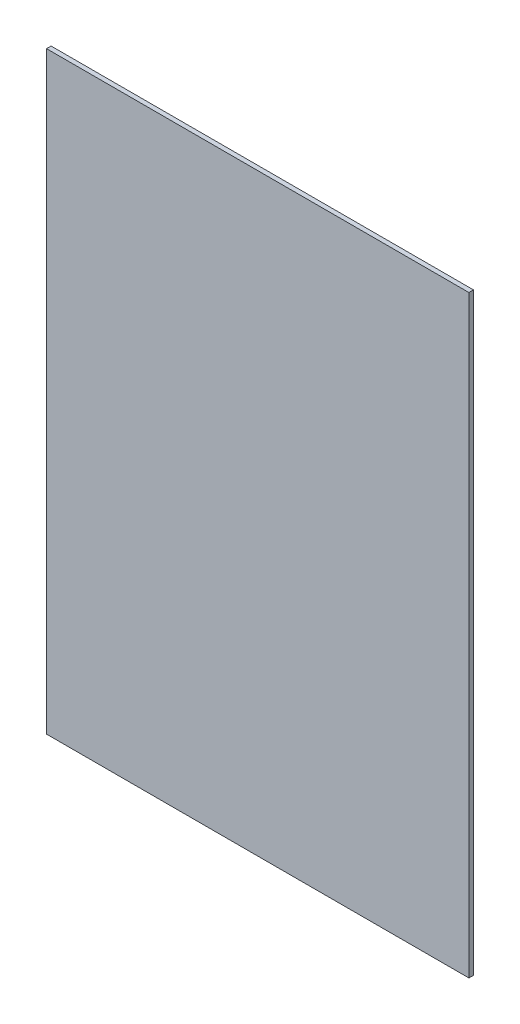
ISO-10303-21;
HEADER;
FILE_DESCRIPTION(('STEP AP214'),'2;1');
FILE_NAME('part.step','',(''),(''),'','','');
FILE_SCHEMA(('AUTOMOTIVE_DESIGN { 1 0 10303 214 1 1 1 1 }'));
ENDSEC;
DATA;
#1=APPLICATION_CONTEXT('core data for automotive mechanical design processes');
#2=APPLICATION_PROTOCOL_DEFINITION('international standard','automotive_design',2000,#1);
#3=PRODUCT_CONTEXT('',#1,'mechanical');
#4=PRODUCT('Part','Part','',(#3));
#5=PRODUCT_RELATED_PRODUCT_CATEGORY('part','',(#4));
#6=PRODUCT_DEFINITION_FORMATION('','',#4);
#7=PRODUCT_DEFINITION_CONTEXT('part definition',#1,'design');
#8=PRODUCT_DEFINITION('design','',#6,#7);
#9=PRODUCT_DEFINITION_SHAPE('','',#8);
#10=(LENGTH_UNIT() NAMED_UNIT(*) SI_UNIT(.MILLI.,.METRE.));
#11=(NAMED_UNIT(*) PLANE_ANGLE_UNIT() SI_UNIT($,.RADIAN.));
#12=(NAMED_UNIT(*) SI_UNIT($,.STERADIAN.) SOLID_ANGLE_UNIT());
#13=UNCERTAINTY_MEASURE_WITH_UNIT(LENGTH_MEASURE(1.E-05),#10,'distance_accuracy_value','');
#14=(GEOMETRIC_REPRESENTATION_CONTEXT(3) GLOBAL_UNCERTAINTY_ASSIGNED_CONTEXT((#13)) GLOBAL_UNIT_ASSIGNED_CONTEXT((#10,
#11,#12)) REPRESENTATION_CONTEXT('',''));
#15=CARTESIAN_POINT('',(0.,0.,0.));
#16=DIRECTION('',(0.,0.,1.));
#17=DIRECTION('',(1.,0.,0.));
#18=AXIS2_PLACEMENT_3D('',#15,#16,#17);
#19=CARTESIAN_POINT('',(185.,260.,4.));
#20=DIRECTION('',(-1.,0.,0.));
#21=DIRECTION('',(0.,-1.,0.));
#22=AXIS2_PLACEMENT_3D('',#19,#20,#21);
#23=PLANE('',#22);
#24=DIRECTION('',(0.,1.,0.));
#25=VECTOR('',#24,1.);
#26=CARTESIAN_POINT('',(185.,260.,0.));
#27=LINE('',#26,#25);
#28=CARTESIAN_POINT('',(185.,-260.,0.));
#29=VERTEX_POINT('',#28);
#30=CARTESIAN_POINT('',(185.,260.,0.));
#31=VERTEX_POINT('',#30);
#32=EDGE_CURVE('E95',#29,#31,#27,.T.);
#33=ORIENTED_EDGE('',*,*,#32,.T.);
#34=DIRECTION('',(0.,0.,-1.));
#35=VECTOR('',#34,1.);
#36=CARTESIAN_POINT('',(185.,260.,4.));
#37=LINE('',#36,#35);
#38=CARTESIAN_POINT('',(185.,260.,4.));
#39=VERTEX_POINT('',#38);
#40=EDGE_CURVE('E11',#39,#31,#37,.T.);
#41=ORIENTED_EDGE('',*,*,#40,.F.);
#42=DIRECTION('',(0.,1.,0.));
#43=VECTOR('',#42,1.);
#44=CARTESIAN_POINT('',(185.,260.,4.));
#45=LINE('',#44,#43);
#46=CARTESIAN_POINT('',(185.,-260.,4.));
#47=VERTEX_POINT('',#46);
#48=EDGE_CURVE('E83',#47,#39,#45,.T.);
#49=ORIENTED_EDGE('',*,*,#48,.F.);
#50=DIRECTION('',(0.,0.,-1.));
#51=VECTOR('',#50,1.);
#52=CARTESIAN_POINT('',(185.,-260.,4.));
#53=LINE('',#52,#51);
#54=EDGE_CURVE('E91',#47,#29,#53,.T.);
#55=ORIENTED_EDGE('',*,*,#54,.T.);
#56=EDGE_LOOP('',(#33,#41,#49,#55));
#57=FACE_BOUND('',#56,.T.);
#58=ADVANCED_FACE('F32',(#57),#23,.F.);
#59=CARTESIAN_POINT('',(-185.,260.,4.));
#60=DIRECTION('',(0.,-1.,0.));
#61=DIRECTION('',(0.,0.,-1.));
#62=AXIS2_PLACEMENT_3D('',#59,#60,#61);
#63=PLANE('',#62);
#64=DIRECTION('',(-1.,0.,0.));
#65=VECTOR('',#64,1.);
#66=CARTESIAN_POINT('',(-185.,260.,0.));
#67=LINE('',#66,#65);
#68=CARTESIAN_POINT('',(-185.,260.,0.));
#69=VERTEX_POINT('',#68);
#70=EDGE_CURVE('E87',#31,#69,#67,.T.);
#71=ORIENTED_EDGE('',*,*,#70,.T.);
#72=DIRECTION('',(0.,0.,-1.));
#73=VECTOR('',#72,1.);
#74=CARTESIAN_POINT('',(-185.,260.,4.));
#75=LINE('',#74,#73);
#76=CARTESIAN_POINT('',(-185.,260.,4.));
#77=VERTEX_POINT('',#76);
#78=EDGE_CURVE('E40',#77,#69,#75,.T.);
#79=ORIENTED_EDGE('',*,*,#78,.F.);
#80=DIRECTION('',(-1.,0.,0.));
#81=VECTOR('',#80,1.);
#82=CARTESIAN_POINT('',(-185.,260.,4.));
#83=LINE('',#82,#81);
#84=EDGE_CURVE('E78',#39,#77,#83,.T.);
#85=ORIENTED_EDGE('',*,*,#84,.F.);
#86=ORIENTED_EDGE('',*,*,#40,.T.);
#87=EDGE_LOOP('',(#71,#79,#85,#86));
#88=FACE_BOUND('',#87,.T.);
#89=ADVANCED_FACE('F86',(#88),#63,.F.);
#90=CARTESIAN_POINT('',(-185.,260.,4.));
#91=DIRECTION('',(1.,0.,0.));
#92=DIRECTION('',(0.,1.,0.));
#93=AXIS2_PLACEMENT_3D('',#90,#91,#92);
#94=PLANE('',#93);
#95=DIRECTION('',(0.,-1.,0.));
#96=VECTOR('',#95,1.);
#97=CARTESIAN_POINT('',(-185.,260.,0.));
#98=LINE('',#97,#96);
#99=CARTESIAN_POINT('',(-185.,-260.,0.));
#100=VERTEX_POINT('',#99);
#101=EDGE_CURVE('E65',#69,#100,#98,.T.);
#102=ORIENTED_EDGE('',*,*,#101,.T.);
#103=DIRECTION('',(0.,0.,-1.));
#104=VECTOR('',#103,1.);
#105=CARTESIAN_POINT('',(-185.,-260.,4.));
#106=LINE('',#105,#104);
#107=CARTESIAN_POINT('',(-185.,-260.,4.));
#108=VERTEX_POINT('',#107);
#109=EDGE_CURVE('E88',#108,#100,#106,.T.);
#110=ORIENTED_EDGE('',*,*,#109,.F.);
#111=DIRECTION('',(0.,-1.,0.));
#112=VECTOR('',#111,1.);
#113=CARTESIAN_POINT('',(-185.,260.,4.));
#114=LINE('',#113,#112);
#115=EDGE_CURVE('E81',#77,#108,#114,.T.);
#116=ORIENTED_EDGE('',*,*,#115,.F.);
#117=ORIENTED_EDGE('',*,*,#78,.T.);
#118=EDGE_LOOP('',(#102,#110,#116,#117));
#119=FACE_BOUND('',#118,.T.);
#120=ADVANCED_FACE('F89',(#119),#94,.F.);
#121=CARTESIAN_POINT('',(-185.,-260.,4.));
#122=DIRECTION('',(0.,1.,0.));
#123=DIRECTION('',(0.,0.,1.));
#124=AXIS2_PLACEMENT_3D('',#121,#122,#123);
#125=PLANE('',#124);
#126=DIRECTION('',(1.,0.,0.));
#127=VECTOR('',#126,1.);
#128=CARTESIAN_POINT('',(-185.,-260.,0.));
#129=LINE('',#128,#127);
#130=EDGE_CURVE('E71',#100,#29,#129,.T.);
#131=ORIENTED_EDGE('',*,*,#130,.T.);
#132=ORIENTED_EDGE('',*,*,#54,.F.);
#133=DIRECTION('',(1.,0.,0.));
#134=VECTOR('',#133,1.);
#135=CARTESIAN_POINT('',(-185.,-260.,4.));
#136=LINE('',#135,#134);
#137=EDGE_CURVE('E48',#108,#47,#136,.T.);
#138=ORIENTED_EDGE('',*,*,#137,.F.);
#139=ORIENTED_EDGE('',*,*,#109,.T.);
#140=EDGE_LOOP('',(#131,#132,#138,#139));
#141=FACE_BOUND('',#140,.T.);
#142=ADVANCED_FACE('F102',(#141),#125,.F.);
#143=CARTESIAN_POINT('',(0.,0.,4.));
#144=DIRECTION('',(0.,0.,1.));
#145=DIRECTION('',(1.,0.,0.));
#146=AXIS2_PLACEMENT_3D('',#143,#144,#145);
#147=PLANE('',#146);
#148=ORIENTED_EDGE('',*,*,#48,.T.);
#149=ORIENTED_EDGE('',*,*,#84,.T.);
#150=ORIENTED_EDGE('',*,*,#115,.T.);
#151=ORIENTED_EDGE('',*,*,#137,.T.);
#152=EDGE_LOOP('',(#148,#149,#150,#151));
#153=FACE_BOUND('',#152,.T.);
#154=ADVANCED_FACE('F79',(#153),#147,.T.);
#155=CARTESIAN_POINT('',(0.,0.,0.));
#156=DIRECTION('',(0.,0.,1.));
#157=DIRECTION('',(1.,0.,0.));
#158=AXIS2_PLACEMENT_3D('',#155,#156,#157);
#159=PLANE('',#158);
#160=ORIENTED_EDGE('',*,*,#32,.F.);
#161=ORIENTED_EDGE('',*,*,#130,.F.);
#162=ORIENTED_EDGE('',*,*,#101,.F.);
#163=ORIENTED_EDGE('',*,*,#70,.F.);
#164=EDGE_LOOP('',(#160,#161,#162,#163));
#165=FACE_BOUND('',#164,.T.);
#166=ADVANCED_FACE('F105',(#165),#159,.F.);
#167=CLOSED_SHELL('',(#58,#89,#120,#142,#154,#166));
#168=MANIFOLD_SOLID_BREP('B2',#167);
#169=ADVANCED_BREP_SHAPE_REPRESENTATION('',(#18,#168),#14);
#170=SHAPE_DEFINITION_REPRESENTATION(#9,#169);
ENDSEC;
END-ISO-10303-21;
